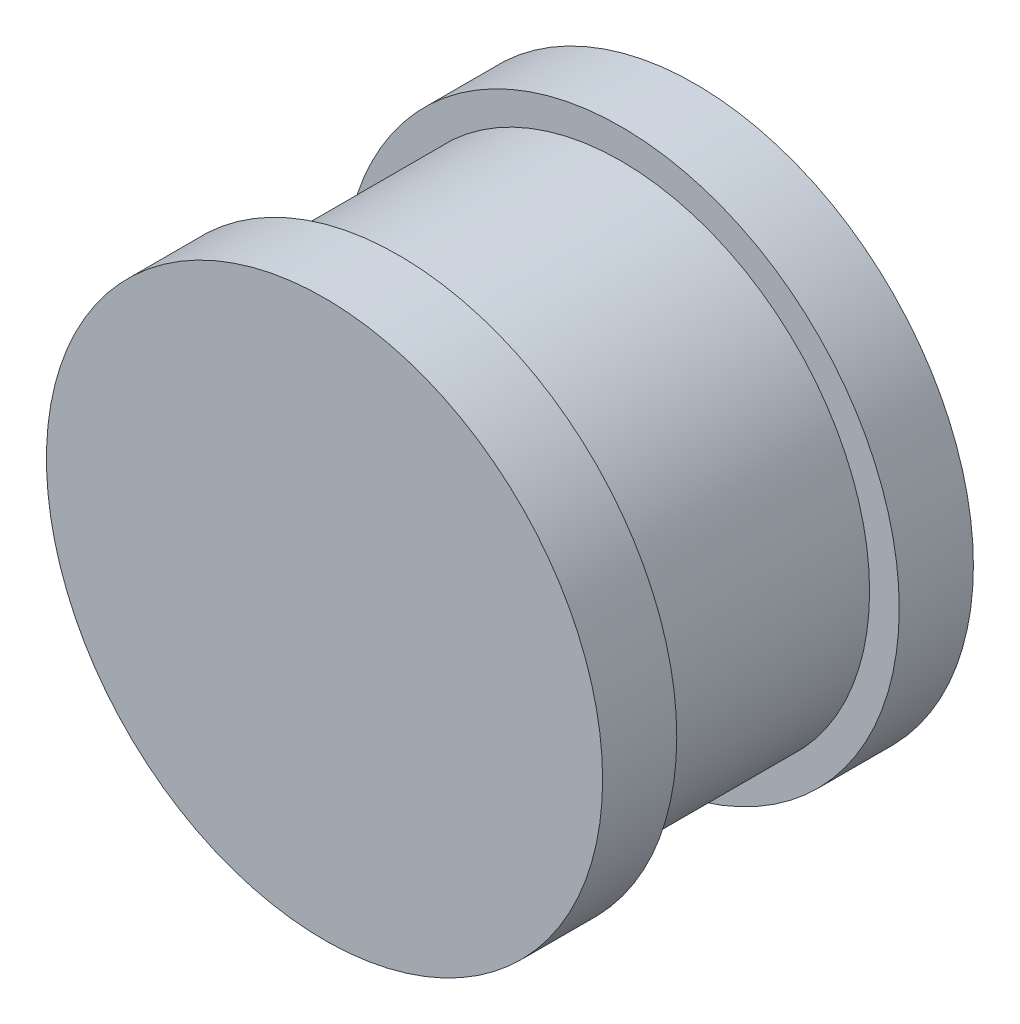
ISO-10303-21;
HEADER;
FILE_DESCRIPTION(('STEP AP214'),'2;1');
FILE_NAME('part.step','',(''),(''),'','','');
FILE_SCHEMA(('AUTOMOTIVE_DESIGN { 1 0 10303 214 1 1 1 1 }'));
ENDSEC;
DATA;
#1=APPLICATION_CONTEXT('core data for automotive mechanical design processes');
#2=APPLICATION_PROTOCOL_DEFINITION('international standard','automotive_design',2000,#1);
#3=PRODUCT_CONTEXT('',#1,'mechanical');
#4=PRODUCT('Part','Part','',(#3));
#5=PRODUCT_RELATED_PRODUCT_CATEGORY('part','',(#4));
#6=PRODUCT_DEFINITION_FORMATION('','',#4);
#7=PRODUCT_DEFINITION_CONTEXT('part definition',#1,'design');
#8=PRODUCT_DEFINITION('design','',#6,#7);
#9=PRODUCT_DEFINITION_SHAPE('','',#8);
#10=(LENGTH_UNIT() NAMED_UNIT(*) SI_UNIT(.MILLI.,.METRE.));
#11=(NAMED_UNIT(*) PLANE_ANGLE_UNIT() SI_UNIT($,.RADIAN.));
#12=(NAMED_UNIT(*) SI_UNIT($,.STERADIAN.) SOLID_ANGLE_UNIT());
#13=UNCERTAINTY_MEASURE_WITH_UNIT(LENGTH_MEASURE(1.E-05),#10,'distance_accuracy_value','');
#14=(GEOMETRIC_REPRESENTATION_CONTEXT(3) GLOBAL_UNCERTAINTY_ASSIGNED_CONTEXT((#13)) GLOBAL_UNIT_ASSIGNED_CONTEXT((#10,
#11,#12)) REPRESENTATION_CONTEXT('',''));
#15=CARTESIAN_POINT('',(0.,0.,0.));
#16=DIRECTION('',(0.,0.,1.));
#17=DIRECTION('',(1.,0.,0.));
#18=AXIS2_PLACEMENT_3D('',#15,#16,#17);
#19=CARTESIAN_POINT('',(0.,0.,0.));
#20=DIRECTION('',(0.,0.,-1.));
#21=DIRECTION('',(-1.,0.,0.));
#22=AXIS2_PLACEMENT_3D('',#19,#20,#21);
#23=PLANE('',#22);
#24=CARTESIAN_POINT('',(0.,0.,0.));
#25=DIRECTION('',(0.,0.,1.));
#26=DIRECTION('',(1.,0.,0.));
#27=AXIS2_PLACEMENT_3D('',#24,#25,#26);
#28=CIRCLE('',#27,3.75);
#29=CARTESIAN_POINT('',(3.75,0.,0.));
#30=VERTEX_POINT('',#29);
#31=EDGE_CURVE('E10',#30,#30,#28,.T.);
#32=ORIENTED_EDGE('',*,*,#31,.F.);
#33=EDGE_LOOP('',(#32));
#34=FACE_BOUND('',#33,.T.);
#35=ADVANCED_FACE('F33',(#34),#23,.T.);
#36=CARTESIAN_POINT('',(0.,0.,5.));
#37=DIRECTION('',(0.,0.,1.));
#38=DIRECTION('',(1.,0.,0.));
#39=AXIS2_PLACEMENT_3D('',#36,#37,#38);
#40=CYLINDRICAL_SURFACE('',#39,3.75);
#41=ORIENTED_EDGE('',*,*,#31,.T.);
#42=EDGE_LOOP('',(#41));
#43=FACE_BOUND('',#42,.T.);
#44=CARTESIAN_POINT('',(0.,0.,1.));
#45=DIRECTION('',(0.,0.,1.));
#46=DIRECTION('',(1.,0.,0.));
#47=AXIS2_PLACEMENT_3D('',#44,#45,#46);
#48=CIRCLE('',#47,3.75);
#49=CARTESIAN_POINT('',(3.75,0.,1.));
#50=VERTEX_POINT('',#49);
#51=EDGE_CURVE('E39',#50,#50,#48,.T.);
#52=ORIENTED_EDGE('',*,*,#51,.F.);
#53=EDGE_LOOP('',(#52));
#54=FACE_BOUND('',#53,.T.);
#55=ADVANCED_FACE('F75',(#43,#54),#40,.T.);
#56=CARTESIAN_POINT('',(3.75,0.,1.));
#57=DIRECTION('',(0.,0.,1.));
#58=DIRECTION('',(1.,0.,0.));
#59=AXIS2_PLACEMENT_3D('',#56,#57,#58);
#60=PLANE('',#59);
#61=ORIENTED_EDGE('',*,*,#51,.T.);
#62=EDGE_LOOP('',(#61));
#63=FACE_BOUND('',#62,.T.);
#64=CARTESIAN_POINT('',(0.,0.,1.));
#65=DIRECTION('',(0.,0.,1.));
#66=DIRECTION('',(1.,0.,0.));
#67=AXIS2_PLACEMENT_3D('',#64,#65,#66);
#68=CIRCLE('',#67,3.35);
#69=CARTESIAN_POINT('',(3.35,0.,1.));
#70=VERTEX_POINT('',#69);
#71=EDGE_CURVE('E43',#70,#70,#68,.T.);
#72=ORIENTED_EDGE('',*,*,#71,.F.);
#73=EDGE_LOOP('',(#72));
#74=FACE_BOUND('',#73,.T.);
#75=ADVANCED_FACE('F80',(#63,#74),#60,.T.);
#76=CARTESIAN_POINT('',(0.,0.,5.));
#77=DIRECTION('',(0.,0.,1.));
#78=DIRECTION('',(1.,0.,0.));
#79=AXIS2_PLACEMENT_3D('',#76,#77,#78);
#80=CYLINDRICAL_SURFACE('',#79,3.35);
#81=ORIENTED_EDGE('',*,*,#71,.T.);
#82=EDGE_LOOP('',(#81));
#83=FACE_BOUND('',#82,.T.);
#84=CARTESIAN_POINT('',(0.,0.,4.));
#85=DIRECTION('',(0.,0.,1.));
#86=DIRECTION('',(1.,0.,0.));
#87=AXIS2_PLACEMENT_3D('',#84,#85,#86);
#88=CIRCLE('',#87,3.35);
#89=CARTESIAN_POINT('',(3.35,0.,4.));
#90=VERTEX_POINT('',#89);
#91=EDGE_CURVE('E47',#90,#90,#88,.T.);
#92=ORIENTED_EDGE('',*,*,#91,.F.);
#93=EDGE_LOOP('',(#92));
#94=FACE_BOUND('',#93,.T.);
#95=ADVANCED_FACE('F71',(#83,#94),#80,.T.);
#96=CARTESIAN_POINT('',(3.35,0.,4.));
#97=DIRECTION('',(0.,0.,-1.));
#98=DIRECTION('',(-1.,0.,0.));
#99=AXIS2_PLACEMENT_3D('',#96,#97,#98);
#100=PLANE('',#99);
#101=ORIENTED_EDGE('',*,*,#91,.T.);
#102=EDGE_LOOP('',(#101));
#103=FACE_BOUND('',#102,.T.);
#104=CARTESIAN_POINT('',(0.,0.,4.));
#105=DIRECTION('',(0.,0.,1.));
#106=DIRECTION('',(1.,0.,0.));
#107=AXIS2_PLACEMENT_3D('',#104,#105,#106);
#108=CIRCLE('',#107,3.75);
#109=CARTESIAN_POINT('',(3.75,0.,4.));
#110=VERTEX_POINT('',#109);
#111=EDGE_CURVE('E52',#110,#110,#108,.T.);
#112=ORIENTED_EDGE('',*,*,#111,.F.);
#113=EDGE_LOOP('',(#112));
#114=FACE_BOUND('',#113,.T.);
#115=ADVANCED_FACE('F63',(#103,#114),#100,.T.);
#116=CARTESIAN_POINT('',(0.,0.,5.));
#117=DIRECTION('',(0.,0.,1.));
#118=DIRECTION('',(1.,0.,0.));
#119=AXIS2_PLACEMENT_3D('',#116,#117,#118);
#120=CYLINDRICAL_SURFACE('',#119,3.75);
#121=ORIENTED_EDGE('',*,*,#111,.T.);
#122=EDGE_LOOP('',(#121));
#123=FACE_BOUND('',#122,.T.);
#124=CARTESIAN_POINT('',(0.,0.,5.));
#125=DIRECTION('',(0.,0.,1.));
#126=DIRECTION('',(1.,0.,0.));
#127=AXIS2_PLACEMENT_3D('',#124,#125,#126);
#128=CIRCLE('',#127,3.75);
#129=CARTESIAN_POINT('',(3.75,0.,5.));
#130=VERTEX_POINT('',#129);
#131=EDGE_CURVE('E55',#130,#130,#128,.T.);
#132=ORIENTED_EDGE('',*,*,#131,.F.);
#133=EDGE_LOOP('',(#132));
#134=FACE_BOUND('',#133,.T.);
#135=ADVANCED_FACE('F61',(#123,#134),#120,.T.);
#136=CARTESIAN_POINT('',(3.75,0.,5.));
#137=DIRECTION('',(0.,0.,1.));
#138=DIRECTION('',(1.,0.,0.));
#139=AXIS2_PLACEMENT_3D('',#136,#137,#138);
#140=PLANE('',#139);
#141=ORIENTED_EDGE('',*,*,#131,.T.);
#142=EDGE_LOOP('',(#141));
#143=FACE_BOUND('',#142,.T.);
#144=ADVANCED_FACE('F59',(#143),#140,.T.);
#145=CLOSED_SHELL('',(#35,#55,#75,#95,#115,#135,#144));
#146=MANIFOLD_SOLID_BREP('B2',#145);
#147=ADVANCED_BREP_SHAPE_REPRESENTATION('',(#18,#146),#14);
#148=SHAPE_DEFINITION_REPRESENTATION(#9,#147);
ENDSEC;
END-ISO-10303-21;
